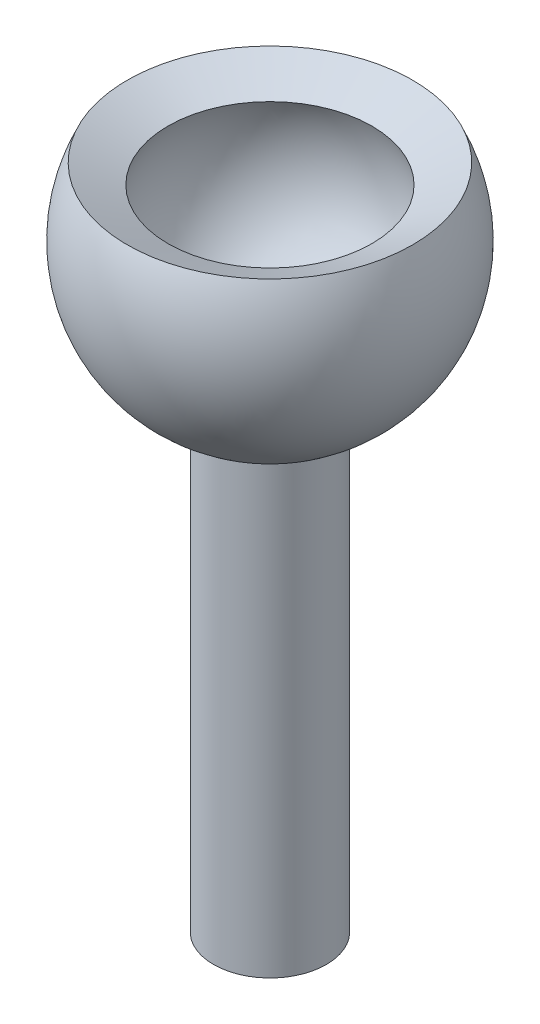
ISO-10303-21;
HEADER;
FILE_DESCRIPTION(('STEP AP214'),'2;1');
FILE_NAME('part.step','',(''),(''),'','','');
FILE_SCHEMA(('AUTOMOTIVE_DESIGN { 1 0 10303 214 1 1 1 1 }'));
ENDSEC;
DATA;
#1=APPLICATION_CONTEXT('core data for automotive mechanical design processes');
#2=APPLICATION_PROTOCOL_DEFINITION('international standard','automotive_design',2000,#1);
#3=PRODUCT_CONTEXT('',#1,'mechanical');
#4=PRODUCT('Part','Part','',(#3));
#5=PRODUCT_RELATED_PRODUCT_CATEGORY('part','',(#4));
#6=PRODUCT_DEFINITION_FORMATION('','',#4);
#7=PRODUCT_DEFINITION_CONTEXT('part definition',#1,'design');
#8=PRODUCT_DEFINITION('design','',#6,#7);
#9=PRODUCT_DEFINITION_SHAPE('','',#8);
#10=(LENGTH_UNIT() NAMED_UNIT(*) SI_UNIT(.MILLI.,.METRE.));
#11=(NAMED_UNIT(*) PLANE_ANGLE_UNIT() SI_UNIT($,.RADIAN.));
#12=(NAMED_UNIT(*) SI_UNIT($,.STERADIAN.) SOLID_ANGLE_UNIT());
#13=UNCERTAINTY_MEASURE_WITH_UNIT(LENGTH_MEASURE(1.E-05),#10,'distance_accuracy_value','');
#14=(GEOMETRIC_REPRESENTATION_CONTEXT(3) GLOBAL_UNCERTAINTY_ASSIGNED_CONTEXT((#13)) GLOBAL_UNIT_ASSIGNED_CONTEXT((#10,
#11,#12)) REPRESENTATION_CONTEXT('',''));
#15=CARTESIAN_POINT('',(0.,0.,0.));
#16=DIRECTION('',(0.,0.,1.));
#17=DIRECTION('',(1.,0.,0.));
#18=AXIS2_PLACEMENT_3D('',#15,#16,#17);
#19=CARTESIAN_POINT('',(0.,0.,0.));
#20=DIRECTION('',(0.,1.,0.));
#21=DIRECTION('',(1.,0.,0.));
#22=AXIS2_PLACEMENT_3D('',#19,#20,#21);
#23=SPHERICAL_SURFACE('',#22,7.);
#24=CARTESIAN_POINT('',(0.,3.,0.));
#25=DIRECTION('',(0.,1.,0.));
#26=DIRECTION('',(0.,0.,1.));
#27=AXIS2_PLACEMENT_3D('',#24,#25,#26);
#28=CIRCLE('',#27,6.32455532033676);
#29=CARTESIAN_POINT('',(6.32455532033676,3.,0.));
#30=VERTEX_POINT('',#29);
#31=EDGE_CURVE('E54',#30,#30,#28,.T.);
#32=CARTESIAN_POINT('',(0.,-6.53834841531101,0.));
#33=DIRECTION('',(0.,1.,0.));
#34=DIRECTION('',(0.,0.,1.));
#35=AXIS2_PLACEMENT_3D('',#32,#33,#34);
#36=CIRCLE('',#35,2.5);
#37=CARTESIAN_POINT('',(2.5,-6.53834841531101,0.));
#38=VERTEX_POINT('',#37);
#39=EDGE_CURVE('E10',#38,#38,#36,.T.);
#40=CARTESIAN_POINT('',(6.32455532033676,3.,0.));
#41=CARTESIAN_POINT('',(6.37607367564032,2.89139664666903,0.));
#42=CARTESIAN_POINT('',(6.42478927363638,2.78146412009729,0.));
#43=CARTESIAN_POINT('',(6.5164976745739,2.55923734357602,0.));
#44=CARTESIAN_POINT('',(6.55949047751535,2.44694309362648,0.));
#45=CARTESIAN_POINT('',(6.63963600790406,2.22028949345333,0.));
#46=CARTESIAN_POINT('',(6.67678873535131,2.10593014322973,0.));
#47=CARTESIAN_POINT('',(6.74515639820579,1.87545012393681,0.));
#48=CARTESIAN_POINT('',(6.77637133361301,1.75932945486749,0.));
#49=CARTESIAN_POINT('',(6.83278036025422,1.52563480267177,0.));
#50=CARTESIAN_POINT('',(6.85797445148821,1.40806081954535,0.));
#51=CARTESIAN_POINT('',(6.90227500470516,1.17177152061364,0.));
#52=CARTESIAN_POINT('',(6.92138146668812,1.05305620480835,0.));
#53=CARTESIAN_POINT('',(6.95345605019821,0.814799217863186,0.));
#54=CARTESIAN_POINT('',(6.96642417172533,0.695257546723318,0.));
#55=CARTESIAN_POINT('',(6.98618767078597,0.45566502765494,0.));
#56=CARTESIAN_POINT('',(6.99298304831948,0.335614179726429,0.));
#57=CARTESIAN_POINT('',(7.00038302821198,0.0953218342927069,0.));
#58=CARTESIAN_POINT('',(7.00098763057097,-0.0249196632125047,0.));
#59=CARTESIAN_POINT('',(6.99600445625737,-0.265274274120857,0.));
#60=CARTESIAN_POINT('',(6.99041667958478,-0.385387387523998,0.));
#61=CARTESIAN_POINT('',(6.97306357302107,-0.625166537354045,0.));
#62=CARTESIAN_POINT('',(6.96129824312995,-0.744832573780952,0.));
#63=CARTESIAN_POINT('',(6.93162124678697,-0.983400062957129,0.));
#64=CARTESIAN_POINT('',(6.9137095803351,-1.1023015157064,0.));
#65=CARTESIAN_POINT('',(6.87178743540974,-1.33902435948727,0.));
#66=CARTESIAN_POINT('',(6.84777695693625,-1.45684575051887,0.));
#67=CARTESIAN_POINT('',(6.79372089432927,-1.69109585852,0.));
#68=CARTESIAN_POINT('',(6.76367531019577,-1.80752457548954,0.));
#69=CARTESIAN_POINT('',(6.69762875541263,-2.03868041816783,0.));
#70=CARTESIAN_POINT('',(6.66162778476299,-2.15340754387659,0.));
#71=CARTESIAN_POINT('',(6.58376597735966,-2.38085580162095,0.));
#72=CARTESIAN_POINT('',(6.54190514060596,-2.49357693365655,0.));
#73=CARTESIAN_POINT('',(6.45243466923239,-2.71671412409158,0.));
#74=CARTESIAN_POINT('',(6.4048250346125,-2.82713018249101,0.));
#75=CARTESIAN_POINT('',(6.30398328887597,-3.04536426168092,0.));
#76=CARTESIAN_POINT('',(6.25075117775932,-3.1531822824714,0.));
#77=CARTESIAN_POINT('',(6.13880571836506,-3.36593421577411,0.));
#78=CARTESIAN_POINT('',(6.08009237008744,-3.47086812828635,0.));
#79=CARTESIAN_POINT('',(5.95734021892714,-3.67757342669118,0.));
#80=CARTESIAN_POINT('',(5.89330141604446,-3.77934481258378,0.));
#81=CARTESIAN_POINT('',(5.76006826811519,-3.97945503045309,0.));
#82=CARTESIAN_POINT('',(5.69087392306861,-4.07779386242981,0.));
#83=CARTESIAN_POINT('',(5.5475132823182,-4.27077805268226,0.));
#84=CARTESIAN_POINT('',(5.47334698661435,-4.365423410958,0.));
#85=CARTESIAN_POINT('',(5.32023922798697,-4.55076953378967,0.));
#86=CARTESIAN_POINT('',(5.24129776506343,-4.6414702983456,0.));
#87=CARTESIAN_POINT('',(5.07884912530495,-4.8186865799107,0.));
#88=CARTESIAN_POINT('',(4.99534194847,-4.90520209691988,0.));
#89=CARTESIAN_POINT('',(4.82398344810686,-5.07381833377074,0.));
#90=CARTESIAN_POINT('',(4.73613212457867,-5.15591905361242,0.));
#91=CARTESIAN_POINT('',(4.5563184249147,-5.31548786166026,0.));
#92=CARTESIAN_POINT('',(4.46435604877893,-5.39295594986641,0.));
#93=CARTESIAN_POINT('',(4.27656424327063,-5.54305394625366,0.));
#94=CARTESIAN_POINT('',(4.1807348138981,-5.61568385443475,0.));
#95=CARTESIAN_POINT('',(3.98546317081946,-5.7559128001426,0.));
#96=CARTESIAN_POINT('',(3.88602095711334,-5.82351183766935,0.));
#97=CARTESIAN_POINT('',(3.68378756570148,-5.95349962228601,0.));
#98=CARTESIAN_POINT('',(3.58099638799574,-6.01588836937592,0.));
#99=CARTESIAN_POINT('',(3.37233790254442,-6.13529026662472,0.));
#100=CARTESIAN_POINT('',(3.26647059479885,-6.1923034167836,0.));
#101=CARTESIAN_POINT('',(3.05194036767726,-6.30080199817475,0.));
#102=CARTESIAN_POINT('',(2.94327744830124,-6.35228742940702,0.));
#103=CARTESIAN_POINT('',(2.7234457153961,-6.44959714224945,0.));
#104=CARTESIAN_POINT('',(2.61227690186698,-6.49542142385963,0.));
#105=CARTESIAN_POINT('',(2.5,-6.53834841531101,0.));
#106=B_SPLINE_CURVE_WITH_KNOTS('',3,(#40,#41,#42,#43,#44,#45,#46,#47,#48,#49,#50,#51,#52,#53,
#54,#55,#56,#57,#58,#59,#60,#61,#62,#63,#64,#65,#66,#67,#68,#69,#70,#71,#72,#73,#74,#75,#76,#77,
#78,#79,#80,#81,#82,#83,#84,#85,#86,#87,#88,#89,#90,#91,#92,#93,#94,#95,#96,#97,#98,#99,#100,
#101,#102,#103,#104,#105),.UNSPECIFIED.,.F.,.F.,(4,2,2,2,2,2,2,2,2,2,2,2,2,2,2,2,2,2,2,2,2,2,2,
2,2,2,2,2,2,2,2,2,4),(0.,0.360569533754701,0.721139067509401,1.0817086012641,1.4422781350188,
1.8028476687735,2.1634172025282,2.5239867362829,2.8845562700376,3.2451258037923,
3.60569533754701,3.96626487130171,4.32683440505641,4.68740393881111,5.04797347256581,
5.40854300632051,5.76911254007521,6.12968207382991,6.49025160758461,6.85082114133931,
7.21139067509401,7.57196020884871,7.93252974260341,8.29309927635811,8.65366881011282,
9.01423834386751,9.37480787762222,9.73537741137692,10.0959469451316,10.4565164788863,
10.817086012641,11.1776555463957,11.5382250801504),.UNSPECIFIED.);
#107=EDGE_CURVE('BSEAM37',#30,#38,#106,.T.);
#108=ORIENTED_EDGE('',*,*,#31,.F.);
#109=ORIENTED_EDGE('',*,*,#39,.T.);
#110=ORIENTED_EDGE('',*,*,#107,.T.);
#111=ORIENTED_EDGE('',*,*,#107,.F.);
#112=EDGE_LOOP('',(#108,#110,#109,#111));
#113=FACE_BOUND('',#112,.T.);
#114=ADVANCED_FACE('F37',(#113),#23,.T.);
#115=CARTESIAN_POINT('',(0.,12.8629636734559,0.));
#116=DIRECTION('',(0.,1.,0.));
#117=DIRECTION('',(0.,0.,1.));
#118=AXIS2_PLACEMENT_3D('',#115,#116,#117);
#119=CYLINDRICAL_SURFACE('',#118,2.5);
#120=ORIENTED_EDGE('',*,*,#39,.F.);
#121=EDGE_LOOP('',(#120));
#122=FACE_BOUND('',#121,.T.);
#123=CARTESIAN_POINT('',(0.,-26.538348415311,0.));
#124=DIRECTION('',(0.,1.,0.));
#125=DIRECTION('',(0.,0.,1.));
#126=AXIS2_PLACEMENT_3D('',#123,#124,#125);
#127=CIRCLE('',#126,2.5);
#128=CARTESIAN_POINT('',(0.,-26.538348415311,2.5));
#129=VERTEX_POINT('',#128);
#130=EDGE_CURVE('E44',#129,#129,#127,.T.);
#131=ORIENTED_EDGE('',*,*,#130,.T.);
#132=EDGE_LOOP('',(#131));
#133=FACE_BOUND('',#132,.T.);
#134=ADVANCED_FACE('F64',(#122,#133),#119,.T.);
#135=CARTESIAN_POINT('',(2.5,-26.538348415311,0.));
#136=DIRECTION('',(0.,1.,0.));
#137=DIRECTION('',(0.,0.,1.));
#138=AXIS2_PLACEMENT_3D('',#135,#136,#137);
#139=PLANE('',#138);
#140=ORIENTED_EDGE('',*,*,#130,.F.);
#141=EDGE_LOOP('',(#140));
#142=FACE_BOUND('',#141,.T.);
#143=ADVANCED_FACE('F68',(#142),#139,.F.);
#144=CARTESIAN_POINT('',(0.,0.,0.));
#145=DIRECTION('',(0.,1.,0.));
#146=DIRECTION('',(1.,0.,0.));
#147=AXIS2_PLACEMENT_3D('',#144,#145,#146);
#148=SPHERICAL_SURFACE('',#147,5.);
#149=CARTESIAN_POINT('',(0.,2.14285714285714,0.));
#150=DIRECTION('',(0.,1.,0.));
#151=DIRECTION('',(0.,0.,1.));
#152=AXIS2_PLACEMENT_3D('',#149,#150,#151);
#153=CIRCLE('',#152,4.51753951452626);
#154=CARTESIAN_POINT('',(0.,2.14285714285714,4.51753951452626));
#155=VERTEX_POINT('',#154);
#156=EDGE_CURVE('E49',#155,#155,#153,.T.);
#157=ORIENTED_EDGE('',*,*,#156,.T.);
#158=EDGE_LOOP('',(#157));
#159=FACE_BOUND('',#158,.T.);
#160=ADVANCED_FACE('F73',(#159),#148,.F.);
#161=CARTESIAN_POINT('',(0.,3.,0.));
#162=DIRECTION('',(0.,1.,0.));
#163=DIRECTION('',(0.,0.,1.));
#164=AXIS2_PLACEMENT_3D('',#161,#162,#163);
#165=CONICAL_SURFACE('',#164,6.32455532033676,1.12788528272126);
#166=ORIENTED_EDGE('',*,*,#156,.F.);
#167=EDGE_LOOP('',(#166));
#168=FACE_BOUND('',#167,.T.);
#169=ORIENTED_EDGE('',*,*,#31,.T.);
#170=EDGE_LOOP('',(#169));
#171=FACE_BOUND('',#170,.T.);
#172=ADVANCED_FACE('F61',(#168,#171),#165,.F.);
#173=CLOSED_SHELL('',(#114,#134,#143,#160,#172));
#174=MANIFOLD_SOLID_BREP('B2',#173);
#175=ADVANCED_BREP_SHAPE_REPRESENTATION('',(#18,#174),#14);
#176=SHAPE_DEFINITION_REPRESENTATION(#9,#175);
ENDSEC;
END-ISO-10303-21;
